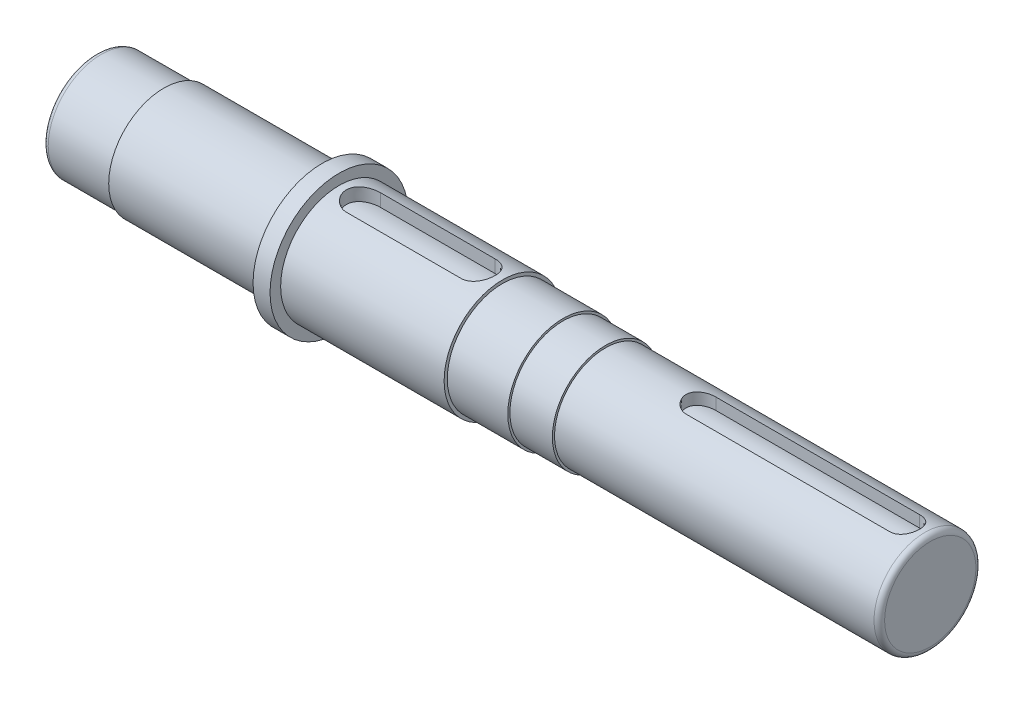
ISO-10303-21;
HEADER;
FILE_DESCRIPTION(('STEP AP214'),'2;1');
FILE_NAME('part.step','',(''),(''),'','','');
FILE_SCHEMA(('AUTOMOTIVE_DESIGN { 1 0 10303 214 1 1 1 1 }'));
ENDSEC;
DATA;
#1=APPLICATION_CONTEXT('core data for automotive mechanical design processes');
#2=APPLICATION_PROTOCOL_DEFINITION('international standard','automotive_design',2000,#1);
#3=PRODUCT_CONTEXT('',#1,'mechanical');
#4=PRODUCT('Part','Part','',(#3));
#5=PRODUCT_RELATED_PRODUCT_CATEGORY('part','',(#4));
#6=PRODUCT_DEFINITION_FORMATION('','',#4);
#7=PRODUCT_DEFINITION_CONTEXT('part definition',#1,'design');
#8=PRODUCT_DEFINITION('design','',#6,#7);
#9=PRODUCT_DEFINITION_SHAPE('','',#8);
#10=(LENGTH_UNIT() NAMED_UNIT(*) SI_UNIT(.MILLI.,.METRE.));
#11=(NAMED_UNIT(*) PLANE_ANGLE_UNIT() SI_UNIT($,.RADIAN.));
#12=(NAMED_UNIT(*) SI_UNIT($,.STERADIAN.) SOLID_ANGLE_UNIT());
#13=UNCERTAINTY_MEASURE_WITH_UNIT(LENGTH_MEASURE(1.E-05),#10,'distance_accuracy_value','');
#14=(GEOMETRIC_REPRESENTATION_CONTEXT(3) GLOBAL_UNCERTAINTY_ASSIGNED_CONTEXT((#13)) GLOBAL_UNIT_ASSIGNED_CONTEXT((#10,
#11,#12)) REPRESENTATION_CONTEXT('',''));
#15=CARTESIAN_POINT('',(0.,0.,0.));
#16=DIRECTION('',(0.,0.,1.));
#17=DIRECTION('',(1.,0.,0.));
#18=AXIS2_PLACEMENT_3D('',#15,#16,#17);
#19=CARTESIAN_POINT('',(0.,0.,0.));
#20=DIRECTION('',(-1.,0.,0.));
#21=DIRECTION('',(0.,0.,1.));
#22=AXIS2_PLACEMENT_3D('',#19,#20,#21);
#23=CYLINDRICAL_SURFACE('',#22,24.);
#24=CARTESIAN_POINT('',(390.5,0.,0.));
#25=DIRECTION('',(-1.,0.,0.));
#26=DIRECTION('',(0.,0.,1.));
#27=AXIS2_PLACEMENT_3D('',#24,#25,#26);
#28=CIRCLE('',#27,24.);
#29=CARTESIAN_POINT('',(390.5,0.,24.));
#30=VERTEX_POINT('',#29);
#31=EDGE_CURVE('E320',#30,#30,#28,.T.);
#32=ORIENTED_EDGE('',*,*,#31,.T.);
#33=EDGE_LOOP('',(#32));
#34=FACE_BOUND('',#33,.T.);
#35=CARTESIAN_POINT('',(240.,0.,0.));
#36=DIRECTION('',(-1.,0.,0.));
#37=DIRECTION('',(0.,0.,1.));
#38=AXIS2_PLACEMENT_3D('',#35,#36,#37);
#39=CIRCLE('',#38,24.);
#40=CARTESIAN_POINT('',(240.,0.,24.));
#41=VERTEX_POINT('',#40);
#42=EDGE_CURVE('E273',#41,#41,#39,.T.);
#43=ORIENTED_EDGE('',*,*,#42,.F.);
#44=EDGE_LOOP('',(#43));
#45=FACE_BOUND('',#44,.T.);
#46=CARTESIAN_POINT('',(381.,22.956480566498,7.00000000000001));
#47=CARTESIAN_POINT('',(381.930184617272,22.956480566498,7.00000000000001));
#48=CARTESIAN_POINT('',(382.842386550896,23.0149523823366,6.81509831079665));
#49=CARTESIAN_POINT('',(384.534773720825,23.2118131608828,6.11108238623155));
#50=CARTESIAN_POINT('',(385.307723807695,23.3487244542818,5.59170049891048));
#51=CARTESIAN_POINT('',(387.232977754885,23.7544902838863,3.66665839678556));
#52=CARTESIAN_POINT('',(387.998216046955,23.9994796805852,1.84390879715608));
#53=CARTESIAN_POINT('',(388.000887044257,24.0002587211302,-0.911777092593129));
#54=CARTESIAN_POINT('',(387.81873573476,23.9453496039411,-1.83118730217382));
#55=CARTESIAN_POINT('',(387.112922129641,23.7539981392086,-3.532787425402));
#56=CARTESIAN_POINT('',(386.597600394624,23.6206292552158,-4.30146042356395));
#57=CARTESIAN_POINT('',(384.659020640703,23.2119024852969,-6.24134086270297));
#58=CARTESIAN_POINT('',(382.860475462863,22.956480566498,-7.00000000000001));
#59=CARTESIAN_POINT('',(381.,22.956480566498,-7.00000000000001));
#60=B_SPLINE_CURVE_WITH_KNOTS('',3,(#46,#47,#48,#49,#50,#51,#52,#53,#54,#55,#56,#57,#58,#59),
.UNSPECIFIED.,.F.,.F.,(4,2,2,2,2,2,4),(0.,0.125000000000001,0.250000000000001,0.500000000000002,
0.625000000000003,0.750000000000004,1.),.UNSPECIFIED.);
#61=CARTESIAN_POINT('',(381.,22.956480566498,7.00000000000003));
#62=VERTEX_POINT('',#61);
#63=CARTESIAN_POINT('',(381.,22.956480566498,-6.99999999999995));
#64=VERTEX_POINT('',#63);
#65=EDGE_CURVE('E126',#62,#64,#60,.T.);
#66=ORIENTED_EDGE('',*,*,#65,.F.);
#67=DIRECTION('',(-1.,0.,0.));
#68=VECTOR('',#67,1.);
#69=CARTESIAN_POINT('',(0.,22.956480566498,7.00000000000006));
#70=LINE('',#69,#68);
#71=CARTESIAN_POINT('',(285.,22.956480566498,7.00000000000003));
#72=VERTEX_POINT('',#71);
#73=EDGE_CURVE('E458',#62,#72,#70,.T.);
#74=ORIENTED_EDGE('',*,*,#73,.T.);
#75=CARTESIAN_POINT('',(285.,22.956480566498,-7.));
#76=CARTESIAN_POINT('',(284.069815382728,22.956480566498,-7.));
#77=CARTESIAN_POINT('',(283.157613449104,23.0149523823366,-6.81509831079664));
#78=CARTESIAN_POINT('',(281.465226279175,23.2118131608828,-6.11108238623153));
#79=CARTESIAN_POINT('',(280.692276192304,23.3487244542818,-5.59170049891047));
#80=CARTESIAN_POINT('',(278.767022245115,23.7544902838863,-3.66665839678555));
#81=CARTESIAN_POINT('',(278.001783953045,23.9994796805852,-1.84390879715607));
#82=CARTESIAN_POINT('',(277.999112955743,24.0002587211302,0.91177709259314));
#83=CARTESIAN_POINT('',(278.18126426524,23.9453496039411,1.83118730217383));
#84=CARTESIAN_POINT('',(278.887077870359,23.7539981392086,3.53278742540201));
#85=CARTESIAN_POINT('',(279.402399605376,23.6206292552158,4.30146042356396));
#86=CARTESIAN_POINT('',(281.340979359296,23.2119024852969,6.24134086270298));
#87=CARTESIAN_POINT('',(283.139524537137,22.956480566498,7.00000000000002));
#88=CARTESIAN_POINT('',(285.,22.956480566498,7.00000000000002));
#89=B_SPLINE_CURVE_WITH_KNOTS('',3,(#75,#76,#77,#78,#79,#80,#81,#82,#83,#84,#85,#86,#87,#88),
.UNSPECIFIED.,.F.,.F.,(4,2,2,2,2,2,4),(0.,0.125000000000001,0.250000000000001,0.500000000000003,
0.625000000000003,0.750000000000004,1.),.UNSPECIFIED.);
#90=CARTESIAN_POINT('',(285.,22.956480566498,-6.99999999999998));
#91=VERTEX_POINT('',#90);
#92=EDGE_CURVE('E119',#91,#72,#89,.T.);
#93=ORIENTED_EDGE('',*,*,#92,.F.);
#94=DIRECTION('',(-1.,0.,0.));
#95=VECTOR('',#94,1.);
#96=CARTESIAN_POINT('',(0.,22.956480566498,-6.99999999999996));
#97=LINE('',#96,#95);
#98=EDGE_CURVE('E135',#64,#91,#97,.T.);
#99=ORIENTED_EDGE('',*,*,#98,.F.);
#100=EDGE_LOOP('',(#66,#74,#93,#99));
#101=FACE_BOUND('',#100,.T.);
#102=ADVANCED_FACE('F47',(#34,#45,#101),#23,.T.);
#103=CARTESIAN_POINT('',(0.,0.,0.));
#104=DIRECTION('',(1.,0.,0.));
#105=DIRECTION('',(0.,0.,-1.));
#106=AXIS2_PLACEMENT_3D('',#103,#104,#105);
#107=PLANE('',#106);
#108=CARTESIAN_POINT('',(0.,0.,0.));
#109=DIRECTION('',(1.,0.,0.));
#110=DIRECTION('',(0.,0.,-1.));
#111=AXIS2_PLACEMENT_3D('',#108,#109,#110);
#112=CIRCLE('',#111,22.5);
#113=CARTESIAN_POINT('',(0.,0.,-22.5));
#114=VERTEX_POINT('',#113);
#115=EDGE_CURVE('E60',#114,#114,#112,.F.);
#116=ORIENTED_EDGE('',*,*,#115,.T.);
#117=EDGE_LOOP('',(#116));
#118=FACE_BOUND('',#117,.T.);
#119=ADVANCED_FACE('F368',(#118),#107,.F.);
#120=CARTESIAN_POINT('',(0.,0.,0.));
#121=DIRECTION('',(-1.,0.,0.));
#122=DIRECTION('',(0.,0.,1.));
#123=AXIS2_PLACEMENT_3D('',#120,#121,#122);
#124=CYLINDRICAL_SURFACE('',#123,25.);
#125=CARTESIAN_POINT('',(2.5,0.,0.));
#126=DIRECTION('',(1.,0.,0.));
#127=DIRECTION('',(0.,0.,-1.));
#128=AXIS2_PLACEMENT_3D('',#125,#126,#127);
#129=CIRCLE('',#128,25.);
#130=CARTESIAN_POINT('',(2.5,0.,-25.));
#131=VERTEX_POINT('',#130);
#132=EDGE_CURVE('E11',#131,#131,#129,.T.);
#133=ORIENTED_EDGE('',*,*,#132,.T.);
#134=EDGE_LOOP('',(#133));
#135=FACE_BOUND('',#134,.T.);
#136=CARTESIAN_POINT('',(32.,0.,0.));
#137=DIRECTION('',(-1.,0.,0.));
#138=DIRECTION('',(0.,0.,1.));
#139=AXIS2_PLACEMENT_3D('',#136,#137,#138);
#140=CIRCLE('',#139,25.);
#141=CARTESIAN_POINT('',(32.,0.,25.));
#142=VERTEX_POINT('',#141);
#143=EDGE_CURVE('E313',#142,#142,#140,.T.);
#144=ORIENTED_EDGE('',*,*,#143,.T.);
#145=EDGE_LOOP('',(#144));
#146=FACE_BOUND('',#145,.T.);
#147=ADVANCED_FACE('F400',(#135,#146),#124,.T.);
#148=CARTESIAN_POINT('',(32.,25.,0.));
#149=DIRECTION('',(1.,0.,0.));
#150=DIRECTION('',(0.,0.,-1.));
#151=AXIS2_PLACEMENT_3D('',#148,#149,#150);
#152=PLANE('',#151);
#153=ORIENTED_EDGE('',*,*,#143,.F.);
#154=EDGE_LOOP('',(#153));
#155=FACE_BOUND('',#154,.T.);
#156=CARTESIAN_POINT('',(32.,0.,0.));
#157=DIRECTION('',(-1.,0.,0.));
#158=DIRECTION('',(0.,0.,1.));
#159=AXIS2_PLACEMENT_3D('',#156,#157,#158);
#160=CIRCLE('',#159,26.);
#161=CARTESIAN_POINT('',(32.,0.,26.));
#162=VERTEX_POINT('',#161);
#163=EDGE_CURVE('E311',#162,#162,#160,.T.);
#164=ORIENTED_EDGE('',*,*,#163,.T.);
#165=EDGE_LOOP('',(#164));
#166=FACE_BOUND('',#165,.T.);
#167=ADVANCED_FACE('F402',(#155,#166),#152,.F.);
#168=CARTESIAN_POINT('',(0.,0.,0.));
#169=DIRECTION('',(-1.,0.,0.));
#170=DIRECTION('',(0.,0.,1.));
#171=AXIS2_PLACEMENT_3D('',#168,#169,#170);
#172=CYLINDRICAL_SURFACE('',#171,26.);
#173=ORIENTED_EDGE('',*,*,#163,.F.);
#174=EDGE_LOOP('',(#173));
#175=FACE_BOUND('',#174,.T.);
#176=CARTESIAN_POINT('',(106.5,0.,0.));
#177=DIRECTION('',(-1.,0.,0.));
#178=DIRECTION('',(0.,0.,1.));
#179=AXIS2_PLACEMENT_3D('',#176,#177,#178);
#180=CIRCLE('',#179,26.);
#181=CARTESIAN_POINT('',(106.5,0.,26.));
#182=VERTEX_POINT('',#181);
#183=EDGE_CURVE('E308',#182,#182,#180,.T.);
#184=ORIENTED_EDGE('',*,*,#183,.T.);
#185=EDGE_LOOP('',(#184));
#186=FACE_BOUND('',#185,.T.);
#187=ADVANCED_FACE('F410',(#175,#186),#172,.T.);
#188=CARTESIAN_POINT('',(106.5,26.,0.));
#189=DIRECTION('',(1.,0.,0.));
#190=DIRECTION('',(0.,0.,-1.));
#191=AXIS2_PLACEMENT_3D('',#188,#189,#190);
#192=PLANE('',#191);
#193=ORIENTED_EDGE('',*,*,#183,.F.);
#194=EDGE_LOOP('',(#193));
#195=FACE_BOUND('',#194,.T.);
#196=CARTESIAN_POINT('',(106.5,0.,0.));
#197=DIRECTION('',(-1.,0.,0.));
#198=DIRECTION('',(0.,0.,1.));
#199=AXIS2_PLACEMENT_3D('',#196,#197,#198);
#200=CIRCLE('',#199,32.5);
#201=CARTESIAN_POINT('',(106.5,0.,32.5));
#202=VERTEX_POINT('',#201);
#203=EDGE_CURVE('E304',#202,#202,#200,.T.);
#204=ORIENTED_EDGE('',*,*,#203,.T.);
#205=EDGE_LOOP('',(#204));
#206=FACE_BOUND('',#205,.T.);
#207=ADVANCED_FACE('F413',(#195,#206),#192,.F.);
#208=CARTESIAN_POINT('',(0.,0.,0.));
#209=DIRECTION('',(-1.,0.,0.));
#210=DIRECTION('',(0.,0.,1.));
#211=AXIS2_PLACEMENT_3D('',#208,#209,#210);
#212=CYLINDRICAL_SURFACE('',#211,32.5);
#213=ORIENTED_EDGE('',*,*,#203,.F.);
#214=EDGE_LOOP('',(#213));
#215=FACE_BOUND('',#214,.T.);
#216=CARTESIAN_POINT('',(114.5,0.,0.));
#217=DIRECTION('',(-1.,0.,0.));
#218=DIRECTION('',(0.,0.,1.));
#219=AXIS2_PLACEMENT_3D('',#216,#217,#218);
#220=CIRCLE('',#219,32.5);
#221=CARTESIAN_POINT('',(114.5,0.,32.5));
#222=VERTEX_POINT('',#221);
#223=EDGE_CURVE('E305',#222,#222,#220,.T.);
#224=ORIENTED_EDGE('',*,*,#223,.T.);
#225=EDGE_LOOP('',(#224));
#226=FACE_BOUND('',#225,.T.);
#227=ADVANCED_FACE('F418',(#215,#226),#212,.T.);
#228=CARTESIAN_POINT('',(114.5,32.5,0.));
#229=DIRECTION('',(-1.,0.,0.));
#230=DIRECTION('',(0.,0.,1.));
#231=AXIS2_PLACEMENT_3D('',#228,#229,#230);
#232=PLANE('',#231);
#233=ORIENTED_EDGE('',*,*,#223,.F.);
#234=EDGE_LOOP('',(#233));
#235=FACE_BOUND('',#234,.T.);
#236=CARTESIAN_POINT('',(114.5,0.,0.));
#237=DIRECTION('',(-1.,0.,0.));
#238=DIRECTION('',(0.,0.,1.));
#239=AXIS2_PLACEMENT_3D('',#236,#237,#238);
#240=CIRCLE('',#239,27.5);
#241=CARTESIAN_POINT('',(114.5,0.,27.5));
#242=VERTEX_POINT('',#241);
#243=EDGE_CURVE('E299',#242,#242,#240,.T.);
#244=ORIENTED_EDGE('',*,*,#243,.T.);
#245=EDGE_LOOP('',(#244));
#246=FACE_BOUND('',#245,.T.);
#247=ADVANCED_FACE('F339',(#235,#246),#232,.F.);
#248=CARTESIAN_POINT('',(0.,0.,0.));
#249=DIRECTION('',(-1.,0.,0.));
#250=DIRECTION('',(0.,0.,1.));
#251=AXIS2_PLACEMENT_3D('',#248,#249,#250);
#252=CYLINDRICAL_SURFACE('',#251,27.5);
#253=CARTESIAN_POINT('',(180.,26.3106442338457,8.));
#254=CARTESIAN_POINT('',(181.063035005528,26.3106442338457,8.));
#255=CARTESIAN_POINT('',(182.105523905988,26.3772734647265,7.7887011777006));
#256=CARTESIAN_POINT('',(184.039699683214,26.6016258534104,6.98411937352506));
#257=CARTESIAN_POINT('',(184.923095257943,26.7576658191,6.39053384658965));
#258=CARTESIAN_POINT('',(186.390000978678,27.0659920504562,4.92378688162709));
#259=CARTESIAN_POINT('',(186.985161836937,27.2193681309942,4.03629409406877));
#260=CARTESIAN_POINT('',(187.785621396139,27.4356960197185,2.11382482197525));
#261=CARTESIAN_POINT('',(187.998980405045,27.4997033906854,1.05749070925456));
#262=CARTESIAN_POINT('',(188.001012103311,27.5002944299277,-1.04200741030025));
#263=CARTESIAN_POINT('',(187.792846434513,27.437705693647,-2.09275072984243));
#264=CARTESIAN_POINT('',(186.986238582998,27.2196026370311,-4.03739168654415));
#265=CARTESIAN_POINT('',(186.397309073583,27.0675862377068,-4.91590083691859));
#266=CARTESIAN_POINT('',(184.181662675062,26.6017094965524,-7.13304107358699));
#267=CARTESIAN_POINT('',(182.126189888135,26.3106442338457,-8.));
#268=CARTESIAN_POINT('',(180.,26.3106442338457,-8.));
#269=B_SPLINE_CURVE_WITH_KNOTS('',3,(#253,#254,#255,#256,#257,#258,#259,#260,#261,#262,#263,
#264,#265,#266,#267,#268),.UNSPECIFIED.,.F.,.F.,(4,2,2,2,2,2,2,4),(0.,0.125,0.25,0.375,0.5,
0.625,0.75,1.),.UNSPECIFIED.);
#270=CARTESIAN_POINT('',(180.,26.3106442338457,8.));
#271=VERTEX_POINT('',#270);
#272=CARTESIAN_POINT('',(180.,26.3106442338457,-8.));
#273=VERTEX_POINT('',#272);
#274=EDGE_CURVE('E282',#271,#273,#269,.T.);
#275=ORIENTED_EDGE('',*,*,#274,.F.);
#276=DIRECTION('',(-1.,0.,0.));
#277=VECTOR('',#276,1.);
#278=CARTESIAN_POINT('',(0.,26.3106442338457,8.));
#279=LINE('',#278,#277);
#280=CARTESIAN_POINT('',(126.,26.3106442338457,8.));
#281=VERTEX_POINT('',#280);
#282=EDGE_CURVE('E710',#271,#281,#279,.T.);
#283=ORIENTED_EDGE('',*,*,#282,.T.);
#284=CARTESIAN_POINT('',(126.,26.3106442338457,-8.));
#285=CARTESIAN_POINT('',(124.936964994472,26.3106442338457,-8.));
#286=CARTESIAN_POINT('',(123.894476094012,26.3772734647265,-7.78870117770061));
#287=CARTESIAN_POINT('',(121.960300316786,26.6016258534104,-6.98411937352506));
#288=CARTESIAN_POINT('',(121.076904742057,26.7576658191,-6.39053384658965));
#289=CARTESIAN_POINT('',(119.609999021322,27.0659920504562,-4.92378688162709));
#290=CARTESIAN_POINT('',(119.014838163063,27.2193681309942,-4.03629409406878));
#291=CARTESIAN_POINT('',(118.214378603861,27.4356960197185,-2.11382482197526));
#292=CARTESIAN_POINT('',(118.001019594955,27.4997033906854,-1.05749070925456));
#293=CARTESIAN_POINT('',(117.998987896689,27.5002944299278,1.04200741030024));
#294=CARTESIAN_POINT('',(118.207153565487,27.437705693647,2.09275072984243));
#295=CARTESIAN_POINT('',(119.013761417002,27.2196026370311,4.03739168654415));
#296=CARTESIAN_POINT('',(119.602690926417,27.0675862377068,4.91590083691859));
#297=CARTESIAN_POINT('',(121.818337324938,26.6017094965524,7.13304107358698));
#298=CARTESIAN_POINT('',(123.873810111865,26.3106442338457,8.));
#299=CARTESIAN_POINT('',(126.,26.3106442338457,8.));
#300=B_SPLINE_CURVE_WITH_KNOTS('',3,(#284,#285,#286,#287,#288,#289,#290,#291,#292,#293,#294,
#295,#296,#297,#298,#299),.UNSPECIFIED.,.F.,.F.,(4,2,2,2,2,2,2,4),(0.,0.125,0.25,0.375,0.5,
0.625,0.75,1.),.UNSPECIFIED.);
#301=CARTESIAN_POINT('',(126.,26.3106442338457,-8.));
#302=VERTEX_POINT('',#301);
#303=EDGE_CURVE('E232',#302,#281,#300,.T.);
#304=ORIENTED_EDGE('',*,*,#303,.F.);
#305=DIRECTION('',(-1.,0.,0.));
#306=VECTOR('',#305,1.);
#307=CARTESIAN_POINT('',(0.,26.3106442338457,-8.));
#308=LINE('',#307,#306);
#309=EDGE_CURVE('E711',#273,#302,#308,.T.);
#310=ORIENTED_EDGE('',*,*,#309,.F.);
#311=EDGE_LOOP('',(#275,#283,#304,#310));
#312=FACE_BOUND('',#311,.T.);
#313=ORIENTED_EDGE('',*,*,#243,.F.);
#314=EDGE_LOOP('',(#313));
#315=FACE_BOUND('',#314,.T.);
#316=CARTESIAN_POINT('',(191.5,0.,0.));
#317=DIRECTION('',(-1.,0.,0.));
#318=DIRECTION('',(0.,0.,1.));
#319=AXIS2_PLACEMENT_3D('',#316,#317,#318);
#320=CIRCLE('',#319,27.5);
#321=CARTESIAN_POINT('',(191.5,0.,27.5));
#322=VERTEX_POINT('',#321);
#323=EDGE_CURVE('E298',#322,#322,#320,.T.);
#324=ORIENTED_EDGE('',*,*,#323,.T.);
#325=EDGE_LOOP('',(#324));
#326=FACE_BOUND('',#325,.T.);
#327=ADVANCED_FACE('F328',(#312,#315,#326),#252,.T.);
#328=CARTESIAN_POINT('',(191.5,27.5,0.));
#329=DIRECTION('',(-1.,0.,0.));
#330=DIRECTION('',(0.,0.,1.));
#331=AXIS2_PLACEMENT_3D('',#328,#329,#330);
#332=PLANE('',#331);
#333=ORIENTED_EDGE('',*,*,#323,.F.);
#334=EDGE_LOOP('',(#333));
#335=FACE_BOUND('',#334,.T.);
#336=CARTESIAN_POINT('',(191.5,0.,0.));
#337=DIRECTION('',(-1.,0.,0.));
#338=DIRECTION('',(0.,0.,1.));
#339=AXIS2_PLACEMENT_3D('',#336,#337,#338);
#340=CIRCLE('',#339,26.);
#341=CARTESIAN_POINT('',(191.5,0.,26.));
#342=VERTEX_POINT('',#341);
#343=EDGE_CURVE('E291',#342,#342,#340,.T.);
#344=ORIENTED_EDGE('',*,*,#343,.T.);
#345=EDGE_LOOP('',(#344));
#346=FACE_BOUND('',#345,.T.);
#347=ADVANCED_FACE('F336',(#335,#346),#332,.F.);
#348=CARTESIAN_POINT('',(0.,0.,0.));
#349=DIRECTION('',(-1.,0.,0.));
#350=DIRECTION('',(0.,0.,1.));
#351=AXIS2_PLACEMENT_3D('',#348,#349,#350);
#352=CYLINDRICAL_SURFACE('',#351,26.);
#353=ORIENTED_EDGE('',*,*,#343,.F.);
#354=EDGE_LOOP('',(#353));
#355=FACE_BOUND('',#354,.T.);
#356=CARTESIAN_POINT('',(220.,0.,0.));
#357=DIRECTION('',(-1.,0.,0.));
#358=DIRECTION('',(0.,0.,1.));
#359=AXIS2_PLACEMENT_3D('',#356,#357,#358);
#360=CIRCLE('',#359,26.);
#361=CARTESIAN_POINT('',(220.,0.,26.));
#362=VERTEX_POINT('',#361);
#363=EDGE_CURVE('E287',#362,#362,#360,.T.);
#364=ORIENTED_EDGE('',*,*,#363,.T.);
#365=EDGE_LOOP('',(#364));
#366=FACE_BOUND('',#365,.T.);
#367=ADVANCED_FACE('F436',(#355,#366),#352,.T.);
#368=CARTESIAN_POINT('',(220.,26.,0.));
#369=DIRECTION('',(-1.,0.,0.));
#370=DIRECTION('',(0.,0.,1.));
#371=AXIS2_PLACEMENT_3D('',#368,#369,#370);
#372=PLANE('',#371);
#373=ORIENTED_EDGE('',*,*,#363,.F.);
#374=EDGE_LOOP('',(#373));
#375=FACE_BOUND('',#374,.T.);
#376=CARTESIAN_POINT('',(220.,0.,0.));
#377=DIRECTION('',(-1.,0.,0.));
#378=DIRECTION('',(0.,0.,1.));
#379=AXIS2_PLACEMENT_3D('',#376,#377,#378);
#380=CIRCLE('',#379,25.);
#381=CARTESIAN_POINT('',(220.,0.,25.));
#382=VERTEX_POINT('',#381);
#383=EDGE_CURVE('E286',#382,#382,#380,.T.);
#384=ORIENTED_EDGE('',*,*,#383,.T.);
#385=EDGE_LOOP('',(#384));
#386=FACE_BOUND('',#385,.T.);
#387=ADVANCED_FACE('F441',(#375,#386),#372,.F.);
#388=CARTESIAN_POINT('',(0.,0.,0.));
#389=DIRECTION('',(-1.,0.,0.));
#390=DIRECTION('',(0.,0.,1.));
#391=AXIS2_PLACEMENT_3D('',#388,#389,#390);
#392=CYLINDRICAL_SURFACE('',#391,25.);
#393=ORIENTED_EDGE('',*,*,#383,.F.);
#394=EDGE_LOOP('',(#393));
#395=FACE_BOUND('',#394,.T.);
#396=CARTESIAN_POINT('',(240.,0.,0.));
#397=DIRECTION('',(-1.,0.,0.));
#398=DIRECTION('',(0.,0.,1.));
#399=AXIS2_PLACEMENT_3D('',#396,#397,#398);
#400=CIRCLE('',#399,25.);
#401=CARTESIAN_POINT('',(240.,0.,25.));
#402=VERTEX_POINT('',#401);
#403=EDGE_CURVE('E283',#402,#402,#400,.T.);
#404=ORIENTED_EDGE('',*,*,#403,.T.);
#405=EDGE_LOOP('',(#404));
#406=FACE_BOUND('',#405,.T.);
#407=ADVANCED_FACE('F447',(#395,#406),#392,.T.);
#408=CARTESIAN_POINT('',(240.,25.,0.));
#409=DIRECTION('',(-1.,0.,0.));
#410=DIRECTION('',(0.,0.,1.));
#411=AXIS2_PLACEMENT_3D('',#408,#409,#410);
#412=PLANE('',#411);
#413=ORIENTED_EDGE('',*,*,#403,.F.);
#414=EDGE_LOOP('',(#413));
#415=FACE_BOUND('',#414,.T.);
#416=ORIENTED_EDGE('',*,*,#42,.T.);
#417=EDGE_LOOP('',(#416));
#418=FACE_BOUND('',#417,.T.);
#419=ADVANCED_FACE('F369',(#415,#418),#412,.F.);
#420=CARTESIAN_POINT('',(393.,24.,0.));
#421=DIRECTION('',(-1.,0.,0.));
#422=DIRECTION('',(0.,0.,1.));
#423=AXIS2_PLACEMENT_3D('',#420,#421,#422);
#424=PLANE('',#423);
#425=CARTESIAN_POINT('',(393.,0.,0.));
#426=DIRECTION('',(-1.,0.,0.));
#427=DIRECTION('',(0.,0.,1.));
#428=AXIS2_PLACEMENT_3D('',#425,#426,#427);
#429=CIRCLE('',#428,21.5);
#430=CARTESIAN_POINT('',(393.,0.,21.5));
#431=VERTEX_POINT('',#430);
#432=EDGE_CURVE('E384',#431,#431,#429,.F.);
#433=ORIENTED_EDGE('',*,*,#432,.T.);
#434=EDGE_LOOP('',(#433));
#435=FACE_BOUND('',#434,.T.);
#436=ADVANCED_FACE('F259',(#435),#424,.F.);
#437=CARTESIAN_POINT('',(0.,-6.,0.));
#438=DIRECTION('',(-1.,0.,0.));
#439=DIRECTION('',(0.,0.,1.));
#440=AXIS2_PLACEMENT_3D('',#437,#438,#439);
#441=CYLINDRICAL_SURFACE('',#440,27.5);
#442=DIRECTION('',(-1.,0.,0.));
#443=VECTOR('',#442,1.);
#444=CARTESIAN_POINT('',(0.,20.3106442338457,8.));
#445=LINE('',#444,#443);
#446=CARTESIAN_POINT('',(180.,20.3106442338457,8.));
#447=VERTEX_POINT('',#446);
#448=CARTESIAN_POINT('',(126.,20.3106442338457,8.));
#449=VERTEX_POINT('',#448);
#450=EDGE_CURVE('E206',#447,#449,#445,.T.);
#451=ORIENTED_EDGE('',*,*,#450,.F.);
#452=CARTESIAN_POINT('',(180.,20.3106442338457,-8.));
#453=CARTESIAN_POINT('',(182.126189888135,20.3106442338457,-8.));
#454=CARTESIAN_POINT('',(184.181662675062,20.6017094965524,-7.13304107358699));
#455=CARTESIAN_POINT('',(186.397309073583,21.0675862377068,-4.91590083691859));
#456=CARTESIAN_POINT('',(186.986238582998,21.2196026370311,-4.03739168654415));
#457=CARTESIAN_POINT('',(187.792846434513,21.437705693647,-2.09275072984243));
#458=CARTESIAN_POINT('',(188.001012103311,21.5002944299277,-1.04200741030025));
#459=CARTESIAN_POINT('',(187.998980405045,21.4997033906854,1.05749070925456));
#460=CARTESIAN_POINT('',(187.785621396139,21.4356960197185,2.11382482197525));
#461=CARTESIAN_POINT('',(186.985161836937,21.2193681309942,4.03629409406877));
#462=CARTESIAN_POINT('',(186.390000978678,21.0659920504562,4.92378688162709));
#463=CARTESIAN_POINT('',(184.923095257943,20.7576658191001,6.39053384658965));
#464=CARTESIAN_POINT('',(184.039699683214,20.6016258534104,6.98411937352506));
#465=CARTESIAN_POINT('',(182.105523905988,20.3772734647265,7.7887011777006));
#466=CARTESIAN_POINT('',(181.063035005528,20.3106442338457,8.));
#467=CARTESIAN_POINT('',(180.,20.3106442338457,8.));
#468=B_SPLINE_CURVE_WITH_KNOTS('',3,(#452,#453,#454,#455,#456,#457,#458,#459,#460,#461,#462,
#463,#464,#465,#466,#467),.UNSPECIFIED.,.F.,.F.,(4,2,2,2,2,2,2,4),(0.,0.25,0.375,0.5,0.625,0.75,
0.875,1.),.UNSPECIFIED.);
#469=CARTESIAN_POINT('',(180.,20.3106442338457,-8.));
#470=VERTEX_POINT('',#469);
#471=EDGE_CURVE('E225',#447,#470,#468,.F.);
#472=ORIENTED_EDGE('',*,*,#471,.T.);
#473=DIRECTION('',(-1.,0.,0.));
#474=VECTOR('',#473,1.);
#475=CARTESIAN_POINT('',(0.,20.3106442338457,-8.));
#476=LINE('',#475,#474);
#477=CARTESIAN_POINT('',(126.,20.3106442338457,-8.));
#478=VERTEX_POINT('',#477);
#479=EDGE_CURVE('E227',#470,#478,#476,.T.);
#480=ORIENTED_EDGE('',*,*,#479,.T.);
#481=CARTESIAN_POINT('',(126.,20.3106442338457,8.));
#482=CARTESIAN_POINT('',(123.873810111865,20.3106442338457,8.));
#483=CARTESIAN_POINT('',(121.818337324938,20.6017094965524,7.13304107358698));
#484=CARTESIAN_POINT('',(119.602690926417,21.0675862377068,4.91590083691859));
#485=CARTESIAN_POINT('',(119.013761417002,21.2196026370311,4.03739168654415));
#486=CARTESIAN_POINT('',(118.207153565487,21.437705693647,2.09275072984243));
#487=CARTESIAN_POINT('',(117.998987896689,21.5002944299278,1.04200741030024));
#488=CARTESIAN_POINT('',(118.001019594955,21.4997033906854,-1.05749070925456));
#489=CARTESIAN_POINT('',(118.214378603861,21.4356960197185,-2.11382482197526));
#490=CARTESIAN_POINT('',(119.014838163063,21.2193681309942,-4.03629409406878));
#491=CARTESIAN_POINT('',(119.609999021322,21.0659920504562,-4.92378688162709));
#492=CARTESIAN_POINT('',(121.076904742057,20.7576658191001,-6.39053384658965));
#493=CARTESIAN_POINT('',(121.960300316786,20.6016258534104,-6.98411937352506));
#494=CARTESIAN_POINT('',(123.894476094012,20.3772734647265,-7.78870117770061));
#495=CARTESIAN_POINT('',(124.936964994472,20.3106442338457,-8.));
#496=CARTESIAN_POINT('',(126.,20.3106442338457,-8.));
#497=B_SPLINE_CURVE_WITH_KNOTS('',3,(#481,#482,#483,#484,#485,#486,#487,#488,#489,#490,#491,
#492,#493,#494,#495,#496),.UNSPECIFIED.,.F.,.F.,(4,2,2,2,2,2,2,4),(0.,0.25,0.375,0.5,0.625,0.75,
0.875,1.),.UNSPECIFIED.);
#498=EDGE_CURVE('E237',#478,#449,#497,.F.);
#499=ORIENTED_EDGE('',*,*,#498,.T.);
#500=EDGE_LOOP('',(#451,#472,#480,#499));
#501=FACE_BOUND('',#500,.T.);
#502=ADVANCED_FACE('F191',(#501),#441,.T.);
#503=CARTESIAN_POINT('',(0.,26.3106442338457,8.));
#504=DIRECTION('',(0.,0.,1.));
#505=DIRECTION('',(1.,0.,0.));
#506=AXIS2_PLACEMENT_3D('',#503,#504,#505);
#507=PLANE('',#506);
#508=ORIENTED_EDGE('',*,*,#450,.T.);
#509=DIRECTION('',(0.,-1.,0.));
#510=VECTOR('',#509,1.);
#511=CARTESIAN_POINT('',(126.,26.3106442338457,8.));
#512=LINE('',#511,#510);
#513=EDGE_CURVE('E248',#281,#449,#512,.T.);
#514=ORIENTED_EDGE('',*,*,#513,.F.);
#515=ORIENTED_EDGE('',*,*,#282,.F.);
#516=DIRECTION('',(0.,-1.,0.));
#517=VECTOR('',#516,1.);
#518=CARTESIAN_POINT('',(180.,26.3106442338457,8.));
#519=LINE('',#518,#517);
#520=EDGE_CURVE('E213',#271,#447,#519,.T.);
#521=ORIENTED_EDGE('',*,*,#520,.T.);
#522=EDGE_LOOP('',(#508,#514,#515,#521));
#523=FACE_BOUND('',#522,.T.);
#524=ADVANCED_FACE('F163',(#523),#507,.F.);
#525=CARTESIAN_POINT('',(180.,26.3106442338457,8.));
#526=CARTESIAN_POINT('',(181.063035005528,26.3106442338457,8.));
#527=CARTESIAN_POINT('',(182.105523905988,26.3772734647265,7.7887011777006));
#528=CARTESIAN_POINT('',(184.039699683214,26.6016258534104,6.98411937352506));
#529=CARTESIAN_POINT('',(184.923095257943,26.7576658191,6.39053384658965));
#530=CARTESIAN_POINT('',(186.390000978678,27.0659920504562,4.92378688162709));
#531=CARTESIAN_POINT('',(186.985161836937,27.2193681309942,4.03629409406877));
#532=CARTESIAN_POINT('',(187.785621396139,27.4356960197185,2.11382482197525));
#533=CARTESIAN_POINT('',(187.998980405045,27.4997033906854,1.05749070925456));
#534=CARTESIAN_POINT('',(188.001012103311,27.5002944299277,-1.04200741030025));
#535=CARTESIAN_POINT('',(187.792846434513,27.437705693647,-2.09275072984243));
#536=CARTESIAN_POINT('',(186.986238582998,27.2196026370311,-4.03739168654415));
#537=CARTESIAN_POINT('',(186.397309073583,27.0675862377068,-4.91590083691859));
#538=CARTESIAN_POINT('',(184.181662675062,26.6017094965524,-7.13304107358699));
#539=CARTESIAN_POINT('',(182.126189888135,26.3106442338457,-8.));
#540=CARTESIAN_POINT('',(180.,26.3106442338457,-8.));
#541=B_SPLINE_CURVE_WITH_KNOTS('',3,(#525,#526,#527,#528,#529,#530,#531,#532,#533,#534,#535,
#536,#537,#538,#539,#540),.UNSPECIFIED.,.F.,.F.,(4,2,2,2,2,2,2,4),(0.,0.125,0.25,0.375,0.5,
0.625,0.75,1.),.UNSPECIFIED.);
#542=DIRECTION('',(0.,-1.,0.));
#543=VECTOR('',#542,1.);
#544=SURFACE_OF_LINEAR_EXTRUSION('',#541,#543);
#545=ORIENTED_EDGE('',*,*,#471,.F.);
#546=ORIENTED_EDGE('',*,*,#520,.F.);
#547=ORIENTED_EDGE('',*,*,#274,.T.);
#548=DIRECTION('',(0.,-1.,0.));
#549=VECTOR('',#548,1.);
#550=CARTESIAN_POINT('',(180.,26.3106442338457,-8.));
#551=LINE('',#550,#549);
#552=EDGE_CURVE('E234',#273,#470,#551,.T.);
#553=ORIENTED_EDGE('',*,*,#552,.T.);
#554=EDGE_LOOP('',(#545,#546,#547,#553));
#555=FACE_BOUND('',#554,.T.);
#556=ADVANCED_FACE('F190',(#555),#544,.T.);
#557=CARTESIAN_POINT('',(0.,26.3106442338457,-8.));
#558=DIRECTION('',(0.,0.,1.));
#559=DIRECTION('',(1.,0.,0.));
#560=AXIS2_PLACEMENT_3D('',#557,#558,#559);
#561=PLANE('',#560);
#562=ORIENTED_EDGE('',*,*,#479,.F.);
#563=ORIENTED_EDGE('',*,*,#552,.F.);
#564=ORIENTED_EDGE('',*,*,#309,.T.);
#565=DIRECTION('',(0.,-1.,0.));
#566=VECTOR('',#565,1.);
#567=CARTESIAN_POINT('',(126.,26.3106442338457,-8.));
#568=LINE('',#567,#566);
#569=EDGE_CURVE('E71',#302,#478,#568,.T.);
#570=ORIENTED_EDGE('',*,*,#569,.T.);
#571=EDGE_LOOP('',(#562,#563,#564,#570));
#572=FACE_BOUND('',#571,.T.);
#573=ADVANCED_FACE('F195',(#572),#561,.T.);
#574=CARTESIAN_POINT('',(126.,26.3106442338457,-8.));
#575=CARTESIAN_POINT('',(124.936964994472,26.3106442338457,-8.));
#576=CARTESIAN_POINT('',(123.894476094012,26.3772734647265,-7.78870117770061));
#577=CARTESIAN_POINT('',(121.960300316786,26.6016258534104,-6.98411937352506));
#578=CARTESIAN_POINT('',(121.076904742057,26.7576658191,-6.39053384658965));
#579=CARTESIAN_POINT('',(119.609999021322,27.0659920504562,-4.92378688162709));
#580=CARTESIAN_POINT('',(119.014838163063,27.2193681309942,-4.03629409406878));
#581=CARTESIAN_POINT('',(118.214378603861,27.4356960197185,-2.11382482197526));
#582=CARTESIAN_POINT('',(118.001019594955,27.4997033906854,-1.05749070925456));
#583=CARTESIAN_POINT('',(117.998987896689,27.5002944299278,1.04200741030024));
#584=CARTESIAN_POINT('',(118.207153565487,27.437705693647,2.09275072984243));
#585=CARTESIAN_POINT('',(119.013761417002,27.2196026370311,4.03739168654415));
#586=CARTESIAN_POINT('',(119.602690926417,27.0675862377068,4.91590083691859));
#587=CARTESIAN_POINT('',(121.818337324938,26.6017094965524,7.13304107358698));
#588=CARTESIAN_POINT('',(123.873810111865,26.3106442338457,8.));
#589=CARTESIAN_POINT('',(126.,26.3106442338457,8.));
#590=B_SPLINE_CURVE_WITH_KNOTS('',3,(#574,#575,#576,#577,#578,#579,#580,#581,#582,#583,#584,
#585,#586,#587,#588,#589),.UNSPECIFIED.,.F.,.F.,(4,2,2,2,2,2,2,4),(0.,0.125,0.25,0.375,0.5,
0.625,0.75,1.),.UNSPECIFIED.);
#591=DIRECTION('',(0.,-1.,0.));
#592=VECTOR('',#591,1.);
#593=SURFACE_OF_LINEAR_EXTRUSION('',#590,#592);
#594=ORIENTED_EDGE('',*,*,#498,.F.);
#595=ORIENTED_EDGE('',*,*,#569,.F.);
#596=ORIENTED_EDGE('',*,*,#303,.T.);
#597=ORIENTED_EDGE('',*,*,#513,.T.);
#598=EDGE_LOOP('',(#594,#595,#596,#597));
#599=FACE_BOUND('',#598,.T.);
#600=ADVANCED_FACE('F159',(#599),#593,.T.);
#601=CARTESIAN_POINT('',(0.,-5.5,0.));
#602=DIRECTION('',(-1.,0.,0.));
#603=DIRECTION('',(0.,0.,1.));
#604=AXIS2_PLACEMENT_3D('',#601,#602,#603);
#605=CYLINDRICAL_SURFACE('',#604,24.);
#606=DIRECTION('',(-1.,0.,0.));
#607=VECTOR('',#606,1.);
#608=CARTESIAN_POINT('',(0.,17.456480566498,7.00000000000006));
#609=LINE('',#608,#607);
#610=CARTESIAN_POINT('',(381.,17.456480566498,7.00000000000003));
#611=VERTEX_POINT('',#610);
#612=CARTESIAN_POINT('',(285.,17.456480566498,7.00000000000003));
#613=VERTEX_POINT('',#612);
#614=EDGE_CURVE('E136',#611,#613,#609,.T.);
#615=ORIENTED_EDGE('',*,*,#614,.F.);
#616=CARTESIAN_POINT('',(381.,17.456480566498,-7.00000000000001));
#617=CARTESIAN_POINT('',(382.860475462863,17.456480566498,-7.00000000000001));
#618=CARTESIAN_POINT('',(384.659020640703,17.7119024852969,-6.24134086270297));
#619=CARTESIAN_POINT('',(386.597600394624,18.1206292552158,-4.30146042356395));
#620=CARTESIAN_POINT('',(387.112922129641,18.2539981392087,-3.532787425402));
#621=CARTESIAN_POINT('',(387.81873573476,18.4453496039411,-1.83118730217382));
#622=CARTESIAN_POINT('',(388.000887044257,18.5002587211302,-0.911777092593129));
#623=CARTESIAN_POINT('',(387.998216046955,18.4994796805852,1.84390879715608));
#624=CARTESIAN_POINT('',(387.232977754885,18.2544902838863,3.66665839678556));
#625=CARTESIAN_POINT('',(385.307723807695,17.8487244542818,5.59170049891048));
#626=CARTESIAN_POINT('',(384.534773720825,17.7118131608828,6.11108238623155));
#627=CARTESIAN_POINT('',(382.842386550896,17.5149523823366,6.81509831079665));
#628=CARTESIAN_POINT('',(381.930184617272,17.456480566498,7.00000000000001));
#629=CARTESIAN_POINT('',(381.,17.456480566498,7.00000000000001));
#630=B_SPLINE_CURVE_WITH_KNOTS('',3,(#616,#617,#618,#619,#620,#621,#622,#623,#624,#625,#626,
#627,#628,#629),.UNSPECIFIED.,.F.,.F.,(4,2,2,2,2,2,4),(0.,0.249999999999996,0.374999999999997,
0.499999999999998,0.749999999999999,0.874999999999999,1.),.UNSPECIFIED.);
#631=CARTESIAN_POINT('',(381.,17.456480566498,-6.99999999999998));
#632=VERTEX_POINT('',#631);
#633=EDGE_CURVE('E123',#611,#632,#630,.F.);
#634=ORIENTED_EDGE('',*,*,#633,.T.);
#635=DIRECTION('',(-1.,0.,0.));
#636=VECTOR('',#635,1.);
#637=CARTESIAN_POINT('',(0.,17.456480566498,-6.99999999999995));
#638=LINE('',#637,#636);
#639=CARTESIAN_POINT('',(285.,17.456480566498,-6.99999999999998));
#640=VERTEX_POINT('',#639);
#641=EDGE_CURVE('E113',#632,#640,#638,.T.);
#642=ORIENTED_EDGE('',*,*,#641,.T.);
#643=CARTESIAN_POINT('',(285.,17.456480566498,7.00000000000002));
#644=CARTESIAN_POINT('',(283.139524537137,17.456480566498,7.00000000000002));
#645=CARTESIAN_POINT('',(281.340979359296,17.7119024852969,6.24134086270298));
#646=CARTESIAN_POINT('',(279.402399605376,18.1206292552158,4.30146042356396));
#647=CARTESIAN_POINT('',(278.887077870359,18.2539981392086,3.53278742540201));
#648=CARTESIAN_POINT('',(278.18126426524,18.4453496039411,1.83118730217383));
#649=CARTESIAN_POINT('',(277.999112955743,18.5002587211302,0.91177709259314));
#650=CARTESIAN_POINT('',(278.001783953045,18.4994796805852,-1.84390879715607));
#651=CARTESIAN_POINT('',(278.767022245115,18.2544902838863,-3.66665839678555));
#652=CARTESIAN_POINT('',(280.692276192304,17.8487244542818,-5.59170049891047));
#653=CARTESIAN_POINT('',(281.465226279175,17.7118131608828,-6.11108238623153));
#654=CARTESIAN_POINT('',(283.157613449104,17.5149523823366,-6.81509831079664));
#655=CARTESIAN_POINT('',(284.069815382728,17.456480566498,-7.));
#656=CARTESIAN_POINT('',(285.,17.456480566498,-7.));
#657=B_SPLINE_CURVE_WITH_KNOTS('',3,(#643,#644,#645,#646,#647,#648,#649,#650,#651,#652,#653,
#654,#655,#656),.UNSPECIFIED.,.F.,.F.,(4,2,2,2,2,2,4),(0.,0.249999999999996,0.374999999999997,
0.499999999999997,0.749999999999999,0.874999999999999,1.),.UNSPECIFIED.);
#658=EDGE_CURVE('E521',#640,#613,#657,.F.);
#659=ORIENTED_EDGE('',*,*,#658,.T.);
#660=EDGE_LOOP('',(#615,#634,#642,#659));
#661=FACE_BOUND('',#660,.T.);
#662=ADVANCED_FACE('F139',(#661),#605,.T.);
#663=CARTESIAN_POINT('',(0.,22.956480566498,7.00000000000006));
#664=DIRECTION('',(0.,0.,1.));
#665=DIRECTION('',(1.,0.,0.));
#666=AXIS2_PLACEMENT_3D('',#663,#664,#665);
#667=PLANE('',#666);
#668=ORIENTED_EDGE('',*,*,#614,.T.);
#669=DIRECTION('',(0.,-1.,0.));
#670=VECTOR('',#669,1.);
#671=CARTESIAN_POINT('',(285.,22.956480566498,7.00000000000002));
#672=LINE('',#671,#670);
#673=EDGE_CURVE('E479',#72,#613,#672,.T.);
#674=ORIENTED_EDGE('',*,*,#673,.F.);
#675=ORIENTED_EDGE('',*,*,#73,.F.);
#676=DIRECTION('',(0.,-1.,0.));
#677=VECTOR('',#676,1.);
#678=CARTESIAN_POINT('',(381.,22.956480566498,7.00000000000001));
#679=LINE('',#678,#677);
#680=EDGE_CURVE('E473',#62,#611,#679,.T.);
#681=ORIENTED_EDGE('',*,*,#680,.T.);
#682=EDGE_LOOP('',(#668,#674,#675,#681));
#683=FACE_BOUND('',#682,.T.);
#684=ADVANCED_FACE('F154',(#683),#667,.F.);
#685=CARTESIAN_POINT('',(381.,22.956480566498,7.00000000000001));
#686=CARTESIAN_POINT('',(381.930184617272,22.956480566498,7.00000000000001));
#687=CARTESIAN_POINT('',(382.842386550896,23.0149523823366,6.81509831079665));
#688=CARTESIAN_POINT('',(384.534773720825,23.2118131608828,6.11108238623155));
#689=CARTESIAN_POINT('',(385.307723807695,23.3487244542818,5.59170049891048));
#690=CARTESIAN_POINT('',(387.232977754885,23.7544902838863,3.66665839678556));
#691=CARTESIAN_POINT('',(387.998216046955,23.9994796805852,1.84390879715608));
#692=CARTESIAN_POINT('',(388.000887044257,24.0002587211302,-0.911777092593129));
#693=CARTESIAN_POINT('',(387.81873573476,23.9453496039411,-1.83118730217382));
#694=CARTESIAN_POINT('',(387.112922129641,23.7539981392086,-3.532787425402));
#695=CARTESIAN_POINT('',(386.597600394624,23.6206292552158,-4.30146042356395));
#696=CARTESIAN_POINT('',(384.659020640703,23.2119024852969,-6.24134086270297));
#697=CARTESIAN_POINT('',(382.860475462863,22.956480566498,-7.00000000000001));
#698=CARTESIAN_POINT('',(381.,22.956480566498,-7.00000000000001));
#699=B_SPLINE_CURVE_WITH_KNOTS('',3,(#685,#686,#687,#688,#689,#690,#691,#692,#693,#694,#695,
#696,#697,#698),.UNSPECIFIED.,.F.,.F.,(4,2,2,2,2,2,4),(0.,0.125000000000001,0.250000000000001,
0.500000000000002,0.625000000000003,0.750000000000004,1.),.UNSPECIFIED.);
#700=DIRECTION('',(0.,-1.,0.));
#701=VECTOR('',#700,1.);
#702=SURFACE_OF_LINEAR_EXTRUSION('',#699,#701);
#703=ORIENTED_EDGE('',*,*,#633,.F.);
#704=ORIENTED_EDGE('',*,*,#680,.F.);
#705=ORIENTED_EDGE('',*,*,#65,.T.);
#706=DIRECTION('',(0.,-1.,0.));
#707=VECTOR('',#706,1.);
#708=CARTESIAN_POINT('',(381.,22.956480566498,-7.00000000000001));
#709=LINE('',#708,#707);
#710=EDGE_CURVE('E61',#64,#632,#709,.T.);
#711=ORIENTED_EDGE('',*,*,#710,.T.);
#712=EDGE_LOOP('',(#703,#704,#705,#711));
#713=FACE_BOUND('',#712,.T.);
#714=ADVANCED_FACE('F124',(#713),#702,.T.);
#715=CARTESIAN_POINT('',(0.,22.956480566498,-6.99999999999995));
#716=DIRECTION('',(0.,0.,1.));
#717=DIRECTION('',(1.,0.,0.));
#718=AXIS2_PLACEMENT_3D('',#715,#716,#717);
#719=PLANE('',#718);
#720=ORIENTED_EDGE('',*,*,#641,.F.);
#721=ORIENTED_EDGE('',*,*,#710,.F.);
#722=ORIENTED_EDGE('',*,*,#98,.T.);
#723=DIRECTION('',(0.,-1.,0.));
#724=VECTOR('',#723,1.);
#725=CARTESIAN_POINT('',(285.,22.956480566498,-6.99999999999995));
#726=LINE('',#725,#724);
#727=EDGE_CURVE('E116',#91,#640,#726,.T.);
#728=ORIENTED_EDGE('',*,*,#727,.T.);
#729=EDGE_LOOP('',(#720,#721,#722,#728));
#730=FACE_BOUND('',#729,.T.);
#731=ADVANCED_FACE('F112',(#730),#719,.T.);
#732=CARTESIAN_POINT('',(285.,22.956480566498,-7.));
#733=CARTESIAN_POINT('',(284.069815382728,22.956480566498,-7.));
#734=CARTESIAN_POINT('',(283.157613449104,23.0149523823366,-6.81509831079664));
#735=CARTESIAN_POINT('',(281.465226279175,23.2118131608828,-6.11108238623153));
#736=CARTESIAN_POINT('',(280.692276192304,23.3487244542818,-5.59170049891047));
#737=CARTESIAN_POINT('',(278.767022245115,23.7544902838863,-3.66665839678555));
#738=CARTESIAN_POINT('',(278.001783953045,23.9994796805852,-1.84390879715607));
#739=CARTESIAN_POINT('',(277.999112955743,24.0002587211302,0.91177709259314));
#740=CARTESIAN_POINT('',(278.18126426524,23.9453496039411,1.83118730217383));
#741=CARTESIAN_POINT('',(278.887077870359,23.7539981392086,3.53278742540201));
#742=CARTESIAN_POINT('',(279.402399605376,23.6206292552158,4.30146042356396));
#743=CARTESIAN_POINT('',(281.340979359296,23.2119024852969,6.24134086270298));
#744=CARTESIAN_POINT('',(283.139524537137,22.956480566498,7.00000000000002));
#745=CARTESIAN_POINT('',(285.,22.956480566498,7.00000000000002));
#746=B_SPLINE_CURVE_WITH_KNOTS('',3,(#732,#733,#734,#735,#736,#737,#738,#739,#740,#741,#742,
#743,#744,#745),.UNSPECIFIED.,.F.,.F.,(4,2,2,2,2,2,4),(0.,0.125000000000001,0.250000000000001,
0.500000000000003,0.625000000000003,0.750000000000004,1.),.UNSPECIFIED.);
#747=DIRECTION('',(0.,-1.,0.));
#748=VECTOR('',#747,1.);
#749=SURFACE_OF_LINEAR_EXTRUSION('',#746,#748);
#750=ORIENTED_EDGE('',*,*,#658,.F.);
#751=ORIENTED_EDGE('',*,*,#727,.F.);
#752=ORIENTED_EDGE('',*,*,#92,.T.);
#753=ORIENTED_EDGE('',*,*,#673,.T.);
#754=EDGE_LOOP('',(#750,#751,#752,#753));
#755=FACE_BOUND('',#754,.T.);
#756=ADVANCED_FACE('F392',(#755),#749,.T.);
#757=CARTESIAN_POINT('',(390.5,0.,0.));
#758=DIRECTION('',(-1.,0.,0.));
#759=DIRECTION('',(0.,0.,1.));
#760=AXIS2_PLACEMENT_3D('',#757,#758,#759);
#761=TOROIDAL_SURFACE('',#760,21.5,2.5);
#762=ORIENTED_EDGE('',*,*,#432,.F.);
#763=EDGE_LOOP('',(#762));
#764=FACE_BOUND('',#763,.T.);
#765=ORIENTED_EDGE('',*,*,#31,.F.);
#766=EDGE_LOOP('',(#765));
#767=FACE_BOUND('',#766,.T.);
#768=ADVANCED_FACE('F156',(#764,#767),#761,.T.);
#769=CARTESIAN_POINT('',(2.5,0.,0.));
#770=DIRECTION('',(1.,0.,0.));
#771=DIRECTION('',(0.,0.,-1.));
#772=AXIS2_PLACEMENT_3D('',#769,#770,#771);
#773=TOROIDAL_SURFACE('',#772,22.5,2.5);
#774=ORIENTED_EDGE('',*,*,#132,.F.);
#775=EDGE_LOOP('',(#774));
#776=FACE_BOUND('',#775,.T.);
#777=ORIENTED_EDGE('',*,*,#115,.F.);
#778=EDGE_LOOP('',(#777));
#779=FACE_BOUND('',#778,.T.);
#780=ADVANCED_FACE('F51',(#776,#779),#773,.T.);
#781=CLOSED_SHELL('',(#102,#119,#147,#167,#187,#207,#227,#247,#327,#347,#367,#387,#407,#419,
#436,#502,#524,#556,#573,#600,#662,#684,#714,#731,#756,#768,#780));
#782=MANIFOLD_SOLID_BREP('B2',#781);
#783=ADVANCED_BREP_SHAPE_REPRESENTATION('',(#18,#782),#14);
#784=SHAPE_DEFINITION_REPRESENTATION(#9,#783);
ENDSEC;
END-ISO-10303-21;
